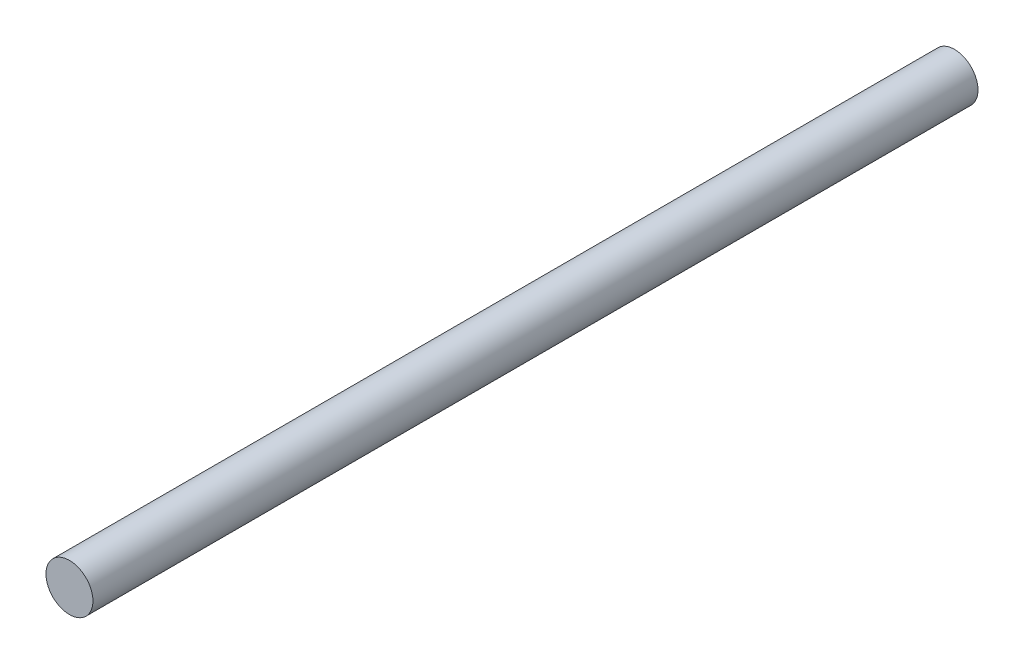
ISO-10303-21;
HEADER;
FILE_DESCRIPTION(('STEP AP214'),'2;1');
FILE_NAME('part.step','',(''),(''),'','','');
FILE_SCHEMA(('AUTOMOTIVE_DESIGN { 1 0 10303 214 1 1 1 1 }'));
ENDSEC;
DATA;
#1=APPLICATION_CONTEXT('core data for automotive mechanical design processes');
#2=APPLICATION_PROTOCOL_DEFINITION('international standard','automotive_design',2000,#1);
#3=PRODUCT_CONTEXT('',#1,'mechanical');
#4=PRODUCT('Part','Part','',(#3));
#5=PRODUCT_RELATED_PRODUCT_CATEGORY('part','',(#4));
#6=PRODUCT_DEFINITION_FORMATION('','',#4);
#7=PRODUCT_DEFINITION_CONTEXT('part definition',#1,'design');
#8=PRODUCT_DEFINITION('design','',#6,#7);
#9=PRODUCT_DEFINITION_SHAPE('','',#8);
#10=(LENGTH_UNIT() NAMED_UNIT(*) SI_UNIT(.MILLI.,.METRE.));
#11=(NAMED_UNIT(*) PLANE_ANGLE_UNIT() SI_UNIT($,.RADIAN.));
#12=(NAMED_UNIT(*) SI_UNIT($,.STERADIAN.) SOLID_ANGLE_UNIT());
#13=UNCERTAINTY_MEASURE_WITH_UNIT(LENGTH_MEASURE(1.E-05),#10,'distance_accuracy_value','');
#14=(GEOMETRIC_REPRESENTATION_CONTEXT(3) GLOBAL_UNCERTAINTY_ASSIGNED_CONTEXT((#13)) GLOBAL_UNIT_ASSIGNED_CONTEXT((#10,
#11,#12)) REPRESENTATION_CONTEXT('',''));
#15=CARTESIAN_POINT('',(0.,0.,0.));
#16=DIRECTION('',(0.,0.,1.));
#17=DIRECTION('',(1.,0.,0.));
#18=AXIS2_PLACEMENT_3D('',#15,#16,#17);
#19=CARTESIAN_POINT('',(0.,0.,414.6));
#20=DIRECTION('',(0.,0.,-1.));
#21=DIRECTION('',(-1.,0.,0.));
#22=AXIS2_PLACEMENT_3D('',#19,#20,#21);
#23=CYLINDRICAL_SURFACE('',#22,11.);
#24=CARTESIAN_POINT('',(0.,0.,414.6));
#25=DIRECTION('',(0.,0.,1.));
#26=DIRECTION('',(1.,0.,0.));
#27=AXIS2_PLACEMENT_3D('',#24,#25,#26);
#28=CIRCLE('',#27,11.);
#29=CARTESIAN_POINT('',(11.,0.,414.6));
#30=VERTEX_POINT('',#29);
#31=EDGE_CURVE('E10',#30,#30,#28,.T.);
#32=ORIENTED_EDGE('',*,*,#31,.F.);
#33=EDGE_LOOP('',(#32));
#34=FACE_BOUND('',#33,.T.);
#35=CARTESIAN_POINT('',(0.,0.,0.));
#36=DIRECTION('',(0.,0.,1.));
#37=DIRECTION('',(1.,0.,0.));
#38=AXIS2_PLACEMENT_3D('',#35,#36,#37);
#39=CIRCLE('',#38,11.);
#40=CARTESIAN_POINT('',(11.,0.,0.));
#41=VERTEX_POINT('',#40);
#42=EDGE_CURVE('E36',#41,#41,#39,.T.);
#43=ORIENTED_EDGE('',*,*,#42,.T.);
#44=EDGE_LOOP('',(#43));
#45=FACE_BOUND('',#44,.T.);
#46=ADVANCED_FACE('F33',(#34,#45),#23,.T.);
#47=CARTESIAN_POINT('',(0.,0.,414.6));
#48=DIRECTION('',(0.,0.,1.));
#49=DIRECTION('',(1.,0.,0.));
#50=AXIS2_PLACEMENT_3D('',#47,#48,#49);
#51=PLANE('',#50);
#52=ORIENTED_EDGE('',*,*,#31,.T.);
#53=EDGE_LOOP('',(#52));
#54=FACE_BOUND('',#53,.T.);
#55=ADVANCED_FACE('F48',(#54),#51,.T.);
#56=CARTESIAN_POINT('',(0.,0.,0.));
#57=DIRECTION('',(0.,0.,1.));
#58=DIRECTION('',(1.,0.,0.));
#59=AXIS2_PLACEMENT_3D('',#56,#57,#58);
#60=PLANE('',#59);
#61=ORIENTED_EDGE('',*,*,#42,.F.);
#62=EDGE_LOOP('',(#61));
#63=FACE_BOUND('',#62,.T.);
#64=ADVANCED_FACE('F46',(#63),#60,.F.);
#65=CLOSED_SHELL('',(#46,#55,#64));
#66=MANIFOLD_SOLID_BREP('B2',#65);
#67=ADVANCED_BREP_SHAPE_REPRESENTATION('',(#18,#66),#14);
#68=SHAPE_DEFINITION_REPRESENTATION(#9,#67);
ENDSEC;
END-ISO-10303-21;
